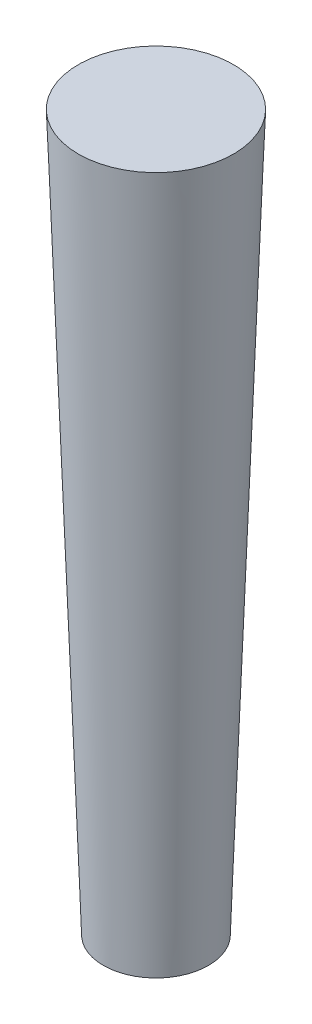
ISO-10303-21;
HEADER;
FILE_DESCRIPTION(('STEP AP214'),'2;1');
FILE_NAME('part.step','',(''),(''),'','','');
FILE_SCHEMA(('AUTOMOTIVE_DESIGN { 1 0 10303 214 1 1 1 1 }'));
ENDSEC;
DATA;
#1=APPLICATION_CONTEXT('core data for automotive mechanical design processes');
#2=APPLICATION_PROTOCOL_DEFINITION('international standard','automotive_design',2000,#1);
#3=PRODUCT_CONTEXT('',#1,'mechanical');
#4=PRODUCT('Part','Part','',(#3));
#5=PRODUCT_RELATED_PRODUCT_CATEGORY('part','',(#4));
#6=PRODUCT_DEFINITION_FORMATION('','',#4);
#7=PRODUCT_DEFINITION_CONTEXT('part definition',#1,'design');
#8=PRODUCT_DEFINITION('design','',#6,#7);
#9=PRODUCT_DEFINITION_SHAPE('','',#8);
#10=(LENGTH_UNIT() NAMED_UNIT(*) SI_UNIT(.MILLI.,.METRE.));
#11=(NAMED_UNIT(*) PLANE_ANGLE_UNIT() SI_UNIT($,.RADIAN.));
#12=(NAMED_UNIT(*) SI_UNIT($,.STERADIAN.) SOLID_ANGLE_UNIT());
#13=UNCERTAINTY_MEASURE_WITH_UNIT(LENGTH_MEASURE(1.E-05),#10,'distance_accuracy_value','');
#14=(GEOMETRIC_REPRESENTATION_CONTEXT(3) GLOBAL_UNCERTAINTY_ASSIGNED_CONTEXT((#13)) GLOBAL_UNIT_ASSIGNED_CONTEXT((#10,
#11,#12)) REPRESENTATION_CONTEXT('',''));
#15=CARTESIAN_POINT('',(0.,0.,0.));
#16=DIRECTION('',(0.,0.,1.));
#17=DIRECTION('',(1.,0.,0.));
#18=AXIS2_PLACEMENT_3D('',#15,#16,#17);
#19=CARTESIAN_POINT('',(0.,0.,0.));
#20=DIRECTION('',(0.,1.,0.));
#21=DIRECTION('',(0.,0.,1.));
#22=AXIS2_PLACEMENT_3D('',#19,#20,#21);
#23=CONICAL_SURFACE('',#22,2.5,0.0349065850398867);
#24=CARTESIAN_POINT('',(0.,34.,0.));
#25=DIRECTION('',(0.,1.,0.));
#26=DIRECTION('',(0.,0.,1.));
#27=AXIS2_PLACEMENT_3D('',#24,#25,#26);
#28=CIRCLE('',#27,3.68730616271943);
#29=CARTESIAN_POINT('',(0.,34.,3.68730616271943));
#30=VERTEX_POINT('',#29);
#31=EDGE_CURVE('E10',#30,#30,#28,.T.);
#32=ORIENTED_EDGE('',*,*,#31,.F.);
#33=EDGE_LOOP('',(#32));
#34=FACE_BOUND('',#33,.T.);
#35=CARTESIAN_POINT('',(0.,0.,0.));
#36=DIRECTION('',(0.,1.,0.));
#37=DIRECTION('',(0.,0.,1.));
#38=AXIS2_PLACEMENT_3D('',#35,#36,#37);
#39=CIRCLE('',#38,2.5);
#40=CARTESIAN_POINT('',(0.,0.,2.5));
#41=VERTEX_POINT('',#40);
#42=EDGE_CURVE('E37',#41,#41,#39,.T.);
#43=ORIENTED_EDGE('',*,*,#42,.T.);
#44=EDGE_LOOP('',(#43));
#45=FACE_BOUND('',#44,.T.);
#46=ADVANCED_FACE('F31',(#34,#45),#23,.T.);
#47=CARTESIAN_POINT('',(0.,34.,0.));
#48=DIRECTION('',(0.,1.,0.));
#49=DIRECTION('',(0.,0.,1.));
#50=AXIS2_PLACEMENT_3D('',#47,#48,#49);
#51=PLANE('',#50);
#52=ORIENTED_EDGE('',*,*,#31,.T.);
#53=EDGE_LOOP('',(#52));
#54=FACE_BOUND('',#53,.T.);
#55=ADVANCED_FACE('F46',(#54),#51,.T.);
#56=CARTESIAN_POINT('',(0.,0.,0.));
#57=DIRECTION('',(0.,1.,0.));
#58=DIRECTION('',(0.,0.,1.));
#59=AXIS2_PLACEMENT_3D('',#56,#57,#58);
#60=PLANE('',#59);
#61=ORIENTED_EDGE('',*,*,#42,.F.);
#62=EDGE_LOOP('',(#61));
#63=FACE_BOUND('',#62,.T.);
#64=ADVANCED_FACE('F44',(#63),#60,.F.);
#65=CLOSED_SHELL('',(#46,#55,#64));
#66=MANIFOLD_SOLID_BREP('B2',#65);
#67=ADVANCED_BREP_SHAPE_REPRESENTATION('',(#18,#66),#14);
#68=SHAPE_DEFINITION_REPRESENTATION(#9,#67);
ENDSEC;
END-ISO-10303-21;
